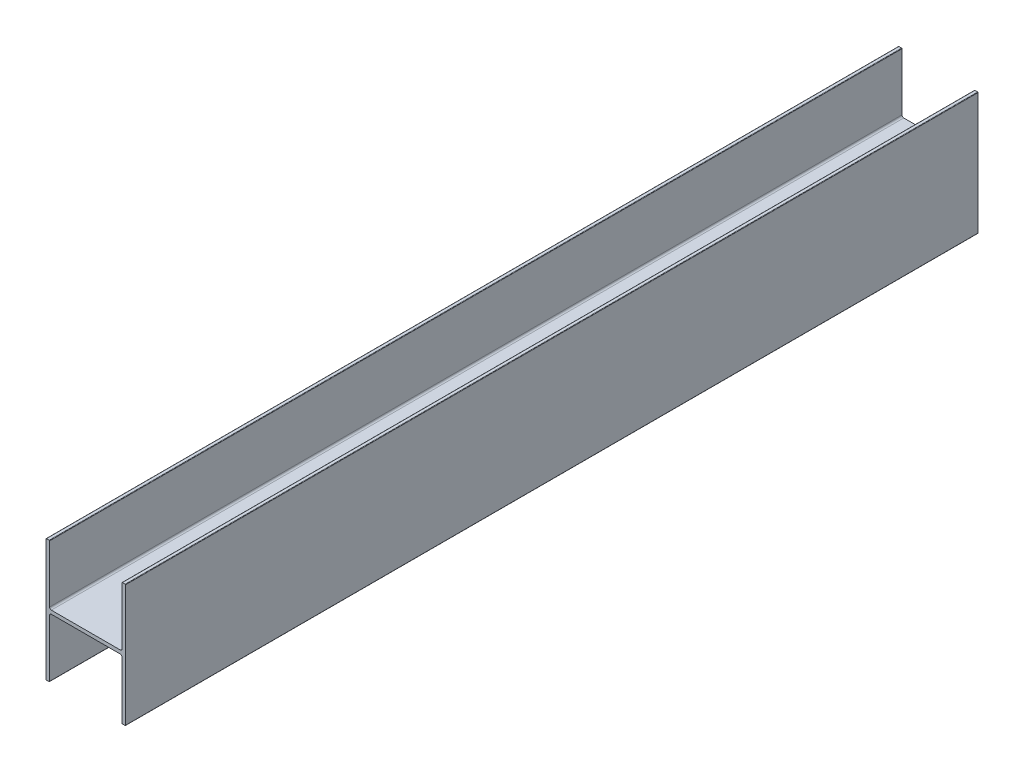
ISO-10303-21;
HEADER;
FILE_DESCRIPTION(('STEP AP214'),'2;1');
FILE_NAME('part.step','',(''),(''),'','','');
FILE_SCHEMA(('AUTOMOTIVE_DESIGN { 1 0 10303 214 1 1 1 1 }'));
ENDSEC;
DATA;
#1=APPLICATION_CONTEXT('core data for automotive mechanical design processes');
#2=APPLICATION_PROTOCOL_DEFINITION('international standard','automotive_design',2000,#1);
#3=PRODUCT_CONTEXT('',#1,'mechanical');
#4=PRODUCT('Part','Part','',(#3));
#5=PRODUCT_RELATED_PRODUCT_CATEGORY('part','',(#4));
#6=PRODUCT_DEFINITION_FORMATION('','',#4);
#7=PRODUCT_DEFINITION_CONTEXT('part definition',#1,'design');
#8=PRODUCT_DEFINITION('design','',#6,#7);
#9=PRODUCT_DEFINITION_SHAPE('','',#8);
#10=(LENGTH_UNIT() NAMED_UNIT(*) SI_UNIT(.MILLI.,.METRE.));
#11=(NAMED_UNIT(*) PLANE_ANGLE_UNIT() SI_UNIT($,.RADIAN.));
#12=(NAMED_UNIT(*) SI_UNIT($,.STERADIAN.) SOLID_ANGLE_UNIT());
#13=UNCERTAINTY_MEASURE_WITH_UNIT(LENGTH_MEASURE(1.E-05),#10,'distance_accuracy_value','');
#14=(GEOMETRIC_REPRESENTATION_CONTEXT(3) GLOBAL_UNCERTAINTY_ASSIGNED_CONTEXT((#13)) GLOBAL_UNIT_ASSIGNED_CONTEXT((#10,
#11,#12)) REPRESENTATION_CONTEXT('',''));
#15=CARTESIAN_POINT('',(0.,0.,0.));
#16=DIRECTION('',(0.,0.,1.));
#17=DIRECTION('',(1.,0.,0.));
#18=AXIS2_PLACEMENT_3D('',#15,#16,#17);
#19=CARTESIAN_POINT('',(12.954,-21.8948,152.4));
#20=DIRECTION('',(0.,1.,0.));
#21=DIRECTION('',(0.,0.,1.));
#22=AXIS2_PLACEMENT_3D('',#19,#20,#21);
#23=PLANE('',#22);
#24=DIRECTION('',(1.,0.,0.));
#25=VECTOR('',#24,1.);
#26=CARTESIAN_POINT('',(12.954,-21.8948,-152.4));
#27=LINE('',#26,#25);
#28=CARTESIAN_POINT('',(13.11275,-21.8948,-152.4));
#29=VERTEX_POINT('',#28);
#30=CARTESIAN_POINT('',(14.06525,-21.8948,-152.4));
#31=VERTEX_POINT('',#30);
#32=EDGE_CURVE('E475',#29,#31,#27,.T.);
#33=ORIENTED_EDGE('',*,*,#32,.T.);
#34=DIRECTION('',(0.,0.,-1.));
#35=VECTOR('',#34,1.);
#36=CARTESIAN_POINT('',(14.06525,-21.8948,152.4));
#37=LINE('',#36,#35);
#38=CARTESIAN_POINT('',(14.06525,-21.8948,152.4));
#39=VERTEX_POINT('',#38);
#40=EDGE_CURVE('E366',#31,#39,#37,.F.);
#41=ORIENTED_EDGE('',*,*,#40,.T.);
#42=DIRECTION('',(1.,0.,0.));
#43=VECTOR('',#42,1.);
#44=CARTESIAN_POINT('',(12.954,-21.8948,152.4));
#45=LINE('',#44,#43);
#46=CARTESIAN_POINT('',(13.11275,-21.8948,152.4));
#47=VERTEX_POINT('',#46);
#48=EDGE_CURVE('E242',#47,#39,#45,.T.);
#49=ORIENTED_EDGE('',*,*,#48,.F.);
#50=DIRECTION('',(0.,0.,-1.));
#51=VECTOR('',#50,1.);
#52=CARTESIAN_POINT('',(13.11275,-21.8948,152.4));
#53=LINE('',#52,#51);
#54=EDGE_CURVE('E362',#47,#29,#53,.T.);
#55=ORIENTED_EDGE('',*,*,#54,.T.);
#56=EDGE_LOOP('',(#33,#41,#49,#55));
#57=FACE_BOUND('',#56,.T.);
#58=ADVANCED_FACE('F41',(#57),#23,.F.);
#59=CARTESIAN_POINT('',(14.224,-21.8948,152.4));
#60=DIRECTION('',(-1.,0.,0.));
#61=DIRECTION('',(0.,-1.,0.));
#62=AXIS2_PLACEMENT_3D('',#59,#60,#61);
#63=PLANE('',#62);
#64=DIRECTION('',(0.,1.,0.));
#65=VECTOR('',#64,1.);
#66=CARTESIAN_POINT('',(14.224,-21.8948,152.4));
#67=LINE('',#66,#65);
#68=CARTESIAN_POINT('',(14.224,-21.73605,152.4));
#69=VERTEX_POINT('',#68);
#70=CARTESIAN_POINT('',(14.224,21.73605,152.4));
#71=VERTEX_POINT('',#70);
#72=EDGE_CURVE('E251',#69,#71,#67,.T.);
#73=ORIENTED_EDGE('',*,*,#72,.F.);
#74=DIRECTION('',(0.,0.,-1.));
#75=VECTOR('',#74,1.);
#76=CARTESIAN_POINT('',(14.224,-21.73605,152.4));
#77=LINE('',#76,#75);
#78=CARTESIAN_POINT('',(14.224,-21.73605,-152.4));
#79=VERTEX_POINT('',#78);
#80=EDGE_CURVE('E334',#69,#79,#77,.T.);
#81=ORIENTED_EDGE('',*,*,#80,.T.);
#82=DIRECTION('',(0.,1.,0.));
#83=VECTOR('',#82,1.);
#84=CARTESIAN_POINT('',(14.224,-21.8948,-152.4));
#85=LINE('',#84,#83);
#86=CARTESIAN_POINT('',(14.224,21.73605,-152.4));
#87=VERTEX_POINT('',#86);
#88=EDGE_CURVE('E491',#79,#87,#85,.T.);
#89=ORIENTED_EDGE('',*,*,#88,.T.);
#90=DIRECTION('',(0.,0.,-1.));
#91=VECTOR('',#90,1.);
#92=CARTESIAN_POINT('',(14.224,21.73605,152.4));
#93=LINE('',#92,#91);
#94=EDGE_CURVE('E331',#87,#71,#93,.F.);
#95=ORIENTED_EDGE('',*,*,#94,.T.);
#96=EDGE_LOOP('',(#73,#81,#89,#95));
#97=FACE_BOUND('',#96,.T.);
#98=ADVANCED_FACE('F490',(#97),#63,.F.);
#99=CARTESIAN_POINT('',(14.224,21.8948,152.4));
#100=DIRECTION('',(0.,-1.,0.));
#101=DIRECTION('',(0.,0.,-1.));
#102=AXIS2_PLACEMENT_3D('',#99,#100,#101);
#103=PLANE('',#102);
#104=DIRECTION('',(-1.,0.,0.));
#105=VECTOR('',#104,1.);
#106=CARTESIAN_POINT('',(14.224,21.8948,152.4));
#107=LINE('',#106,#105);
#108=CARTESIAN_POINT('',(14.06525,21.8948,152.4));
#109=VERTEX_POINT('',#108);
#110=CARTESIAN_POINT('',(13.11275,21.8948,152.4));
#111=VERTEX_POINT('',#110);
#112=EDGE_CURVE('E255',#109,#111,#107,.T.);
#113=ORIENTED_EDGE('',*,*,#112,.F.);
#114=DIRECTION('',(0.,0.,-1.));
#115=VECTOR('',#114,1.);
#116=CARTESIAN_POINT('',(14.06525,21.8948,152.4));
#117=LINE('',#116,#115);
#118=CARTESIAN_POINT('',(14.06525,21.8948,-152.4));
#119=VERTEX_POINT('',#118);
#120=EDGE_CURVE('E415',#109,#119,#117,.T.);
#121=ORIENTED_EDGE('',*,*,#120,.T.);
#122=DIRECTION('',(-1.,0.,0.));
#123=VECTOR('',#122,1.);
#124=CARTESIAN_POINT('',(14.224,21.8948,-152.4));
#125=LINE('',#124,#123);
#126=CARTESIAN_POINT('',(13.11275,21.8948,-152.4));
#127=VERTEX_POINT('',#126);
#128=EDGE_CURVE('E495',#119,#127,#125,.T.);
#129=ORIENTED_EDGE('',*,*,#128,.T.);
#130=DIRECTION('',(0.,0.,-1.));
#131=VECTOR('',#130,1.);
#132=CARTESIAN_POINT('',(13.11275,21.8948,152.4));
#133=LINE('',#132,#131);
#134=EDGE_CURVE('E412',#127,#111,#133,.F.);
#135=ORIENTED_EDGE('',*,*,#134,.T.);
#136=EDGE_LOOP('',(#113,#121,#129,#135));
#137=FACE_BOUND('',#136,.T.);
#138=ADVANCED_FACE('F550',(#137),#103,.F.);
#139=CARTESIAN_POINT('',(12.954,21.8948,152.4));
#140=DIRECTION('',(1.,0.,0.));
#141=DIRECTION('',(0.,1.,0.));
#142=AXIS2_PLACEMENT_3D('',#139,#140,#141);
#143=PLANE('',#142);
#144=DIRECTION('',(0.,-1.,0.));
#145=VECTOR('',#144,1.);
#146=CARTESIAN_POINT('',(12.954,21.8948,152.4));
#147=LINE('',#146,#145);
#148=CARTESIAN_POINT('',(12.954,21.73605,152.4));
#149=VERTEX_POINT('',#148);
#150=CARTESIAN_POINT('',(12.954,1.26999999999999,152.4));
#151=VERTEX_POINT('',#150);
#152=EDGE_CURVE('E259',#149,#151,#147,.T.);
#153=ORIENTED_EDGE('',*,*,#152,.F.);
#154=DIRECTION('',(0.,0.,-1.));
#155=VECTOR('',#154,1.);
#156=CARTESIAN_POINT('',(12.954,21.73605,152.4));
#157=LINE('',#156,#155);
#158=CARTESIAN_POINT('',(12.954,21.73605,-152.4));
#159=VERTEX_POINT('',#158);
#160=EDGE_CURVE('E419',#149,#159,#157,.T.);
#161=ORIENTED_EDGE('',*,*,#160,.T.);
#162=DIRECTION('',(0.,-1.,0.));
#163=VECTOR('',#162,1.);
#164=CARTESIAN_POINT('',(12.954,21.8948,-152.4));
#165=LINE('',#164,#163);
#166=CARTESIAN_POINT('',(12.954,1.26999999999999,-152.4));
#167=VERTEX_POINT('',#166);
#168=EDGE_CURVE('E501',#159,#167,#165,.T.);
#169=ORIENTED_EDGE('',*,*,#168,.T.);
#170=DIRECTION('',(0.,0.,-1.));
#171=VECTOR('',#170,1.);
#172=CARTESIAN_POINT('',(12.954,1.26999999999999,152.4));
#173=LINE('',#172,#171);
#174=EDGE_CURVE('E304',#167,#151,#173,.F.);
#175=ORIENTED_EDGE('',*,*,#174,.T.);
#176=EDGE_LOOP('',(#153,#161,#169,#175));
#177=FACE_BOUND('',#176,.T.);
#178=ADVANCED_FACE('F618',(#177),#143,.F.);
#179=CARTESIAN_POINT('',(12.954,0.634999999999994,152.4));
#180=DIRECTION('',(0.,-1.,0.));
#181=DIRECTION('',(1.,0.,0.));
#182=AXIS2_PLACEMENT_3D('',#179,#180,#181);
#183=PLANE('',#182);
#184=DIRECTION('',(-1.,0.,0.));
#185=VECTOR('',#184,1.);
#186=CARTESIAN_POINT('',(12.954,0.634999999999994,152.4));
#187=LINE('',#186,#185);
#188=CARTESIAN_POINT('',(12.319,0.634999999999994,152.4));
#189=VERTEX_POINT('',#188);
#190=CARTESIAN_POINT('',(-12.319,0.635,152.4));
#191=VERTEX_POINT('',#190);
#192=EDGE_CURVE('E262',#189,#191,#187,.T.);
#193=ORIENTED_EDGE('',*,*,#192,.F.);
#194=DIRECTION('',(0.,0.,-1.));
#195=VECTOR('',#194,1.);
#196=CARTESIAN_POINT('',(12.319,0.634999999999994,-152.4));
#197=LINE('',#196,#195);
#198=CARTESIAN_POINT('',(12.319,0.634999999999994,-152.4));
#199=VERTEX_POINT('',#198);
#200=EDGE_CURVE('E300',#189,#199,#197,.T.);
#201=ORIENTED_EDGE('',*,*,#200,.T.);
#202=DIRECTION('',(-1.,0.,0.));
#203=VECTOR('',#202,1.);
#204=CARTESIAN_POINT('',(12.954,0.634999999999994,-152.4));
#205=LINE('',#204,#203);
#206=CARTESIAN_POINT('',(-12.319,0.635,-152.4));
#207=VERTEX_POINT('',#206);
#208=EDGE_CURVE('E450',#199,#207,#205,.T.);
#209=ORIENTED_EDGE('',*,*,#208,.T.);
#210=DIRECTION('',(0.,0.,-1.));
#211=VECTOR('',#210,1.);
#212=CARTESIAN_POINT('',(-12.319,0.635,152.4));
#213=LINE('',#212,#211);
#214=EDGE_CURVE('E297',#207,#191,#213,.F.);
#215=ORIENTED_EDGE('',*,*,#214,.T.);
#216=EDGE_LOOP('',(#193,#201,#209,#215));
#217=FACE_BOUND('',#216,.T.);
#218=ADVANCED_FACE('F513',(#217),#183,.F.);
#219=CARTESIAN_POINT('',(-12.954,0.635,152.4));
#220=DIRECTION('',(-1.,0.,0.));
#221=DIRECTION('',(0.,-1.,0.));
#222=AXIS2_PLACEMENT_3D('',#219,#220,#221);
#223=PLANE('',#222);
#224=DIRECTION('',(0.,1.,0.));
#225=VECTOR('',#224,1.);
#226=CARTESIAN_POINT('',(-12.954,0.635,-152.4));
#227=LINE('',#226,#225);
#228=CARTESIAN_POINT('',(-12.954,1.27,-152.4));
#229=VERTEX_POINT('',#228);
#230=CARTESIAN_POINT('',(-12.954,21.73605,-152.4));
#231=VERTEX_POINT('',#230);
#232=EDGE_CURVE('E443',#229,#231,#227,.T.);
#233=ORIENTED_EDGE('',*,*,#232,.T.);
#234=DIRECTION('',(0.,0.,-1.));
#235=VECTOR('',#234,1.);
#236=CARTESIAN_POINT('',(-12.954,21.73605,152.4));
#237=LINE('',#236,#235);
#238=CARTESIAN_POINT('',(-12.954,21.73605,152.4));
#239=VERTEX_POINT('',#238);
#240=EDGE_CURVE('E11',#231,#239,#237,.F.);
#241=ORIENTED_EDGE('',*,*,#240,.T.);
#242=DIRECTION('',(0.,1.,0.));
#243=VECTOR('',#242,1.);
#244=CARTESIAN_POINT('',(-12.954,0.635,152.4));
#245=LINE('',#244,#243);
#246=CARTESIAN_POINT('',(-12.954,1.27,152.4));
#247=VERTEX_POINT('',#246);
#248=EDGE_CURVE('E266',#247,#239,#245,.T.);
#249=ORIENTED_EDGE('',*,*,#248,.F.);
#250=DIRECTION('',(0.,0.,-1.));
#251=VECTOR('',#250,1.);
#252=CARTESIAN_POINT('',(-12.954,1.27,-152.4));
#253=LINE('',#252,#251);
#254=EDGE_CURVE('E218',#247,#229,#253,.T.);
#255=ORIENTED_EDGE('',*,*,#254,.T.);
#256=EDGE_LOOP('',(#233,#241,#249,#255));
#257=FACE_BOUND('',#256,.T.);
#258=ADVANCED_FACE('F521',(#257),#223,.F.);
#259=CARTESIAN_POINT('',(-12.954,21.8948,152.4));
#260=DIRECTION('',(0.,-1.,0.));
#261=DIRECTION('',(0.,0.,-1.));
#262=AXIS2_PLACEMENT_3D('',#259,#260,#261);
#263=PLANE('',#262);
#264=DIRECTION('',(-1.,0.,0.));
#265=VECTOR('',#264,1.);
#266=CARTESIAN_POINT('',(-12.954,21.8948,152.4));
#267=LINE('',#266,#265);
#268=CARTESIAN_POINT('',(-13.11275,21.8948,152.4));
#269=VERTEX_POINT('',#268);
#270=CARTESIAN_POINT('',(-14.06525,21.8948,152.4));
#271=VERTEX_POINT('',#270);
#272=EDGE_CURVE('E270',#269,#271,#267,.T.);
#273=ORIENTED_EDGE('',*,*,#272,.F.);
#274=DIRECTION('',(0.,0.,-1.));
#275=VECTOR('',#274,1.);
#276=CARTESIAN_POINT('',(-13.11275,21.8948,152.4));
#277=LINE('',#276,#275);
#278=CARTESIAN_POINT('',(-13.11275,21.8948,-152.4));
#279=VERTEX_POINT('',#278);
#280=EDGE_CURVE('E50',#269,#279,#277,.T.);
#281=ORIENTED_EDGE('',*,*,#280,.T.);
#282=DIRECTION('',(-1.,0.,0.));
#283=VECTOR('',#282,1.);
#284=CARTESIAN_POINT('',(-12.954,21.8948,-152.4));
#285=LINE('',#284,#283);
#286=CARTESIAN_POINT('',(-14.06525,21.8948,-152.4));
#287=VERTEX_POINT('',#286);
#288=EDGE_CURVE('E434',#279,#287,#285,.T.);
#289=ORIENTED_EDGE('',*,*,#288,.T.);
#290=DIRECTION('',(0.,0.,-1.));
#291=VECTOR('',#290,1.);
#292=CARTESIAN_POINT('',(-14.06525,21.8948,152.4));
#293=LINE('',#292,#291);
#294=EDGE_CURVE('E423',#287,#271,#293,.F.);
#295=ORIENTED_EDGE('',*,*,#294,.T.);
#296=EDGE_LOOP('',(#273,#281,#289,#295));
#297=FACE_BOUND('',#296,.T.);
#298=ADVANCED_FACE('F433',(#297),#263,.F.);
#299=CARTESIAN_POINT('',(-14.224,21.8948,152.4));
#300=DIRECTION('',(1.,0.,0.));
#301=DIRECTION('',(0.,1.,0.));
#302=AXIS2_PLACEMENT_3D('',#299,#300,#301);
#303=PLANE('',#302);
#304=DIRECTION('',(0.,-1.,0.));
#305=VECTOR('',#304,1.);
#306=CARTESIAN_POINT('',(-14.224,21.8948,-152.4));
#307=LINE('',#306,#305);
#308=CARTESIAN_POINT('',(-14.224,21.73605,-152.4));
#309=VERTEX_POINT('',#308);
#310=CARTESIAN_POINT('',(-14.224,-21.73605,-152.4));
#311=VERTEX_POINT('',#310);
#312=EDGE_CURVE('E442',#309,#311,#307,.T.);
#313=ORIENTED_EDGE('',*,*,#312,.T.);
#314=DIRECTION('',(0.,0.,-1.));
#315=VECTOR('',#314,1.);
#316=CARTESIAN_POINT('',(-14.224,-21.73605,152.4));
#317=LINE('',#316,#315);
#318=CARTESIAN_POINT('',(-14.224,-21.73605,152.4));
#319=VERTEX_POINT('',#318);
#320=EDGE_CURVE('E409',#311,#319,#317,.F.);
#321=ORIENTED_EDGE('',*,*,#320,.T.);
#322=DIRECTION('',(0.,-1.,0.));
#323=VECTOR('',#322,1.);
#324=CARTESIAN_POINT('',(-14.224,21.8948,152.4));
#325=LINE('',#324,#323);
#326=CARTESIAN_POINT('',(-14.224,21.73605,152.4));
#327=VERTEX_POINT('',#326);
#328=EDGE_CURVE('E274',#327,#319,#325,.T.);
#329=ORIENTED_EDGE('',*,*,#328,.F.);
#330=DIRECTION('',(0.,0.,-1.));
#331=VECTOR('',#330,1.);
#332=CARTESIAN_POINT('',(-14.224,21.73605,152.4));
#333=LINE('',#332,#331);
#334=EDGE_CURVE('E405',#327,#309,#333,.T.);
#335=ORIENTED_EDGE('',*,*,#334,.T.);
#336=EDGE_LOOP('',(#313,#321,#329,#335));
#337=FACE_BOUND('',#336,.T.);
#338=ADVANCED_FACE('F529',(#337),#303,.F.);
#339=CARTESIAN_POINT('',(-14.224,-21.8948,152.4));
#340=DIRECTION('',(0.,1.,0.));
#341=DIRECTION('',(0.,0.,1.));
#342=AXIS2_PLACEMENT_3D('',#339,#340,#341);
#343=PLANE('',#342);
#344=DIRECTION('',(1.,0.,0.));
#345=VECTOR('',#344,1.);
#346=CARTESIAN_POINT('',(-14.224,-21.8948,-152.4));
#347=LINE('',#346,#345);
#348=CARTESIAN_POINT('',(-14.06525,-21.8948,-152.4));
#349=VERTEX_POINT('',#348);
#350=CARTESIAN_POINT('',(-13.11275,-21.8948,-152.4));
#351=VERTEX_POINT('',#350);
#352=EDGE_CURVE('E244',#349,#351,#347,.T.);
#353=ORIENTED_EDGE('',*,*,#352,.T.);
#354=DIRECTION('',(0.,0.,-1.));
#355=VECTOR('',#354,1.);
#356=CARTESIAN_POINT('',(-13.11275,-21.8948,152.4));
#357=LINE('',#356,#355);
#358=CARTESIAN_POINT('',(-13.11275,-21.8948,152.4));
#359=VERTEX_POINT('',#358);
#360=EDGE_CURVE('E402',#351,#359,#357,.F.);
#361=ORIENTED_EDGE('',*,*,#360,.T.);
#362=DIRECTION('',(1.,0.,0.));
#363=VECTOR('',#362,1.);
#364=CARTESIAN_POINT('',(-14.224,-21.8948,152.4));
#365=LINE('',#364,#363);
#366=CARTESIAN_POINT('',(-14.06525,-21.8948,152.4));
#367=VERTEX_POINT('',#366);
#368=EDGE_CURVE('E278',#367,#359,#365,.T.);
#369=ORIENTED_EDGE('',*,*,#368,.F.);
#370=DIRECTION('',(0.,0.,-1.));
#371=VECTOR('',#370,1.);
#372=CARTESIAN_POINT('',(-14.06525,-21.8948,152.4));
#373=LINE('',#372,#371);
#374=EDGE_CURVE('E398',#367,#349,#373,.T.);
#375=ORIENTED_EDGE('',*,*,#374,.T.);
#376=EDGE_LOOP('',(#353,#361,#369,#375));
#377=FACE_BOUND('',#376,.T.);
#378=ADVANCED_FACE('F459',(#377),#343,.F.);
#379=CARTESIAN_POINT('',(-12.954,-21.8948,152.4));
#380=DIRECTION('',(-1.,0.,0.));
#381=DIRECTION('',(0.,-1.,0.));
#382=AXIS2_PLACEMENT_3D('',#379,#380,#381);
#383=PLANE('',#382);
#384=DIRECTION('',(0.,1.,0.));
#385=VECTOR('',#384,1.);
#386=CARTESIAN_POINT('',(-12.954,-21.8948,152.4));
#387=LINE('',#386,#385);
#388=CARTESIAN_POINT('',(-12.954,-21.73605,152.4));
#389=VERTEX_POINT('',#388);
#390=CARTESIAN_POINT('',(-12.954,-1.27,152.4));
#391=VERTEX_POINT('',#390);
#392=EDGE_CURVE('E281',#389,#391,#387,.T.);
#393=ORIENTED_EDGE('',*,*,#392,.F.);
#394=DIRECTION('',(0.,0.,-1.));
#395=VECTOR('',#394,1.);
#396=CARTESIAN_POINT('',(-12.954,-21.73605,152.4));
#397=LINE('',#396,#395);
#398=CARTESIAN_POINT('',(-12.954,-21.73605,-152.4));
#399=VERTEX_POINT('',#398);
#400=EDGE_CURVE('E394',#389,#399,#397,.T.);
#401=ORIENTED_EDGE('',*,*,#400,.T.);
#402=DIRECTION('',(0.,1.,0.));
#403=VECTOR('',#402,1.);
#404=CARTESIAN_POINT('',(-12.954,-21.8948,-152.4));
#405=LINE('',#404,#403);
#406=CARTESIAN_POINT('',(-12.954,-1.27,-152.4));
#407=VERTEX_POINT('',#406);
#408=EDGE_CURVE('E237',#399,#407,#405,.T.);
#409=ORIENTED_EDGE('',*,*,#408,.T.);
#410=DIRECTION('',(0.,0.,-1.));
#411=VECTOR('',#410,1.);
#412=CARTESIAN_POINT('',(-12.954,-1.27,152.4));
#413=LINE('',#412,#411);
#414=EDGE_CURVE('E212',#407,#391,#413,.F.);
#415=ORIENTED_EDGE('',*,*,#414,.T.);
#416=EDGE_LOOP('',(#393,#401,#409,#415));
#417=FACE_BOUND('',#416,.T.);
#418=ADVANCED_FACE('F466',(#417),#383,.F.);
#419=CARTESIAN_POINT('',(-12.954,-0.635,152.4));
#420=DIRECTION('',(0.,1.,0.));
#421=DIRECTION('',(-1.,0.,0.));
#422=AXIS2_PLACEMENT_3D('',#419,#420,#421);
#423=PLANE('',#422);
#424=DIRECTION('',(1.,0.,0.));
#425=VECTOR('',#424,1.);
#426=CARTESIAN_POINT('',(-12.954,-0.635,152.4));
#427=LINE('',#426,#425);
#428=CARTESIAN_POINT('',(-12.319,-0.635,152.4));
#429=VERTEX_POINT('',#428);
#430=CARTESIAN_POINT('',(12.319,-0.634999999999994,152.4));
#431=VERTEX_POINT('',#430);
#432=EDGE_CURVE('E227',#429,#431,#427,.T.);
#433=ORIENTED_EDGE('',*,*,#432,.F.);
#434=DIRECTION('',(0.,0.,-1.));
#435=VECTOR('',#434,1.);
#436=CARTESIAN_POINT('',(-12.319,-0.635,-152.4));
#437=LINE('',#436,#435);
#438=CARTESIAN_POINT('',(-12.319,-0.635,-152.4));
#439=VERTEX_POINT('',#438);
#440=EDGE_CURVE('E210',#429,#439,#437,.T.);
#441=ORIENTED_EDGE('',*,*,#440,.T.);
#442=DIRECTION('',(1.,0.,0.));
#443=VECTOR('',#442,1.);
#444=CARTESIAN_POINT('',(-12.954,-0.635,-152.4));
#445=LINE('',#444,#443);
#446=CARTESIAN_POINT('',(12.319,-0.634999999999994,-152.4));
#447=VERTEX_POINT('',#446);
#448=EDGE_CURVE('E224',#439,#447,#445,.T.);
#449=ORIENTED_EDGE('',*,*,#448,.T.);
#450=DIRECTION('',(0.,0.,-1.));
#451=VECTOR('',#450,1.);
#452=CARTESIAN_POINT('',(12.319,-0.634999999999994,152.4));
#453=LINE('',#452,#451);
#454=EDGE_CURVE('E229',#447,#431,#453,.F.);
#455=ORIENTED_EDGE('',*,*,#454,.T.);
#456=EDGE_LOOP('',(#433,#441,#449,#455));
#457=FACE_BOUND('',#456,.T.);
#458=ADVANCED_FACE('F223',(#457),#423,.F.);
#459=CARTESIAN_POINT('',(12.954,-0.634999999999994,152.4));
#460=DIRECTION('',(1.,0.,0.));
#461=DIRECTION('',(0.,1.,0.));
#462=AXIS2_PLACEMENT_3D('',#459,#460,#461);
#463=PLANE('',#462);
#464=DIRECTION('',(0.,-1.,0.));
#465=VECTOR('',#464,1.);
#466=CARTESIAN_POINT('',(12.954,-0.634999999999994,-152.4));
#467=LINE('',#466,#465);
#468=CARTESIAN_POINT('',(12.954,-1.26999999999999,-152.4));
#469=VERTEX_POINT('',#468);
#470=CARTESIAN_POINT('',(12.954,-21.73605,-152.4));
#471=VERTEX_POINT('',#470);
#472=EDGE_CURVE('E236',#469,#471,#467,.T.);
#473=ORIENTED_EDGE('',*,*,#472,.T.);
#474=DIRECTION('',(0.,0.,-1.));
#475=VECTOR('',#474,1.);
#476=CARTESIAN_POINT('',(12.954,-21.73605,152.4));
#477=LINE('',#476,#475);
#478=CARTESIAN_POINT('',(12.954,-21.73605,152.4));
#479=VERTEX_POINT('',#478);
#480=EDGE_CURVE('E57',#471,#479,#477,.F.);
#481=ORIENTED_EDGE('',*,*,#480,.T.);
#482=DIRECTION('',(0.,-1.,0.));
#483=VECTOR('',#482,1.);
#484=CARTESIAN_POINT('',(12.954,-0.634999999999994,152.4));
#485=LINE('',#484,#483);
#486=CARTESIAN_POINT('',(12.954,-1.26999999999999,152.4));
#487=VERTEX_POINT('',#486);
#488=EDGE_CURVE('E286',#487,#479,#485,.T.);
#489=ORIENTED_EDGE('',*,*,#488,.F.);
#490=DIRECTION('',(0.,0.,-1.));
#491=VECTOR('',#490,1.);
#492=CARTESIAN_POINT('',(12.954,-1.26999999999999,-152.4));
#493=LINE('',#492,#491);
#494=EDGE_CURVE('E293',#487,#469,#493,.T.);
#495=ORIENTED_EDGE('',*,*,#494,.T.);
#496=EDGE_LOOP('',(#473,#481,#489,#495));
#497=FACE_BOUND('',#496,.T.);
#498=ADVANCED_FACE('F472',(#497),#463,.F.);
#499=CARTESIAN_POINT('',(14.224,-21.8948,152.4));
#500=DIRECTION('',(0.,0.,1.));
#501=DIRECTION('',(1.,0.,0.));
#502=AXIS2_PLACEMENT_3D('',#499,#500,#501);
#503=PLANE('',#502);
#504=ORIENTED_EDGE('',*,*,#48,.T.);
#505=CARTESIAN_POINT('',(14.06525,-21.73605,152.4));
#506=DIRECTION('',(0.,0.,1.));
#507=DIRECTION('',(1.,0.,0.));
#508=AXIS2_PLACEMENT_3D('',#505,#506,#507);
#509=CIRCLE('',#508,0.15875);
#510=EDGE_CURVE('E389',#39,#69,#509,.T.);
#511=ORIENTED_EDGE('',*,*,#510,.T.);
#512=ORIENTED_EDGE('',*,*,#72,.T.);
#513=CARTESIAN_POINT('',(14.06525,21.73605,152.4));
#514=DIRECTION('',(0.,0.,1.));
#515=DIRECTION('',(1.,0.,0.));
#516=AXIS2_PLACEMENT_3D('',#513,#514,#515);
#517=CIRCLE('',#516,0.15875);
#518=EDGE_CURVE('E378',#71,#109,#517,.T.);
#519=ORIENTED_EDGE('',*,*,#518,.T.);
#520=ORIENTED_EDGE('',*,*,#112,.T.);
#521=CARTESIAN_POINT('',(13.11275,21.73605,152.4));
#522=DIRECTION('',(0.,0.,1.));
#523=DIRECTION('',(1.,0.,0.));
#524=AXIS2_PLACEMENT_3D('',#521,#522,#523);
#525=CIRCLE('',#524,0.15875);
#526=EDGE_CURVE('E375',#111,#149,#525,.T.);
#527=ORIENTED_EDGE('',*,*,#526,.T.);
#528=ORIENTED_EDGE('',*,*,#152,.T.);
#529=CARTESIAN_POINT('',(12.319,1.26999999999999,152.4));
#530=DIRECTION('',(0.,0.,1.));
#531=DIRECTION('',(1.,0.,0.));
#532=AXIS2_PLACEMENT_3D('',#529,#530,#531);
#533=CIRCLE('',#532,0.635);
#534=EDGE_CURVE('E322',#151,#189,#533,.F.);
#535=ORIENTED_EDGE('',*,*,#534,.T.);
#536=ORIENTED_EDGE('',*,*,#192,.T.);
#537=CARTESIAN_POINT('',(-12.319,1.27,152.4));
#538=DIRECTION('',(0.,0.,1.));
#539=DIRECTION('',(1.,0.,0.));
#540=AXIS2_PLACEMENT_3D('',#537,#538,#539);
#541=CIRCLE('',#540,0.635);
#542=EDGE_CURVE('E328',#191,#247,#541,.F.);
#543=ORIENTED_EDGE('',*,*,#542,.T.);
#544=ORIENTED_EDGE('',*,*,#248,.T.);
#545=CARTESIAN_POINT('',(-13.11275,21.73605,152.4));
#546=DIRECTION('',(0.,0.,1.));
#547=DIRECTION('',(1.,0.,0.));
#548=AXIS2_PLACEMENT_3D('',#545,#546,#547);
#549=CIRCLE('',#548,0.15875);
#550=EDGE_CURVE('E372',#239,#269,#549,.T.);
#551=ORIENTED_EDGE('',*,*,#550,.T.);
#552=ORIENTED_EDGE('',*,*,#272,.T.);
#553=CARTESIAN_POINT('',(-14.06525,21.73605,152.4));
#554=DIRECTION('',(0.,0.,1.));
#555=DIRECTION('',(1.,0.,0.));
#556=AXIS2_PLACEMENT_3D('',#553,#554,#555);
#557=CIRCLE('',#556,0.15875);
#558=EDGE_CURVE('E369',#271,#327,#557,.T.);
#559=ORIENTED_EDGE('',*,*,#558,.T.);
#560=ORIENTED_EDGE('',*,*,#328,.T.);
#561=CARTESIAN_POINT('',(-14.06525,-21.73605,152.4));
#562=DIRECTION('',(0.,0.,1.));
#563=DIRECTION('',(1.,0.,0.));
#564=AXIS2_PLACEMENT_3D('',#561,#562,#563);
#565=CIRCLE('',#564,0.15875);
#566=EDGE_CURVE('E381',#319,#367,#565,.T.);
#567=ORIENTED_EDGE('',*,*,#566,.T.);
#568=ORIENTED_EDGE('',*,*,#368,.T.);
#569=CARTESIAN_POINT('',(-13.11275,-21.73605,152.4));
#570=DIRECTION('',(0.,0.,1.));
#571=DIRECTION('',(1.,0.,0.));
#572=AXIS2_PLACEMENT_3D('',#569,#570,#571);
#573=CIRCLE('',#572,0.15875);
#574=EDGE_CURVE('E65',#359,#389,#573,.T.);
#575=ORIENTED_EDGE('',*,*,#574,.T.);
#576=ORIENTED_EDGE('',*,*,#392,.T.);
#577=CARTESIAN_POINT('',(-12.319,-1.27,152.4));
#578=DIRECTION('',(0.,0.,1.));
#579=DIRECTION('',(1.,0.,0.));
#580=AXIS2_PLACEMENT_3D('',#577,#578,#579);
#581=CIRCLE('',#580,0.635);
#582=EDGE_CURVE('E217',#391,#429,#581,.F.);
#583=ORIENTED_EDGE('',*,*,#582,.T.);
#584=ORIENTED_EDGE('',*,*,#432,.T.);
#585=CARTESIAN_POINT('',(12.319,-1.26999999999999,152.4));
#586=DIRECTION('',(0.,0.,1.));
#587=DIRECTION('',(1.,0.,0.));
#588=AXIS2_PLACEMENT_3D('',#585,#586,#587);
#589=CIRCLE('',#588,0.635);
#590=EDGE_CURVE('E315',#431,#487,#589,.F.);
#591=ORIENTED_EDGE('',*,*,#590,.T.);
#592=ORIENTED_EDGE('',*,*,#488,.T.);
#593=CARTESIAN_POINT('',(13.11275,-21.73605,152.4));
#594=DIRECTION('',(0.,0.,1.));
#595=DIRECTION('',(1.,0.,0.));
#596=AXIS2_PLACEMENT_3D('',#593,#594,#595);
#597=CIRCLE('',#596,0.15875);
#598=EDGE_CURVE('E386',#479,#47,#597,.T.);
#599=ORIENTED_EDGE('',*,*,#598,.T.);
#600=EDGE_LOOP('',(#504,#511,#512,#519,#520,#527,#528,#535,#536,#543,#544,#551,#552,#559,#560,
#567,#568,#575,#576,#583,#584,#591,#592,#599));
#601=FACE_BOUND('',#600,.T.);
#602=ADVANCED_FACE('F467',(#601),#503,.T.);
#603=CARTESIAN_POINT('',(14.224,-21.8948,-152.4));
#604=DIRECTION('',(0.,0.,1.));
#605=DIRECTION('',(1.,0.,0.));
#606=AXIS2_PLACEMENT_3D('',#603,#604,#605);
#607=PLANE('',#606);
#608=ORIENTED_EDGE('',*,*,#88,.F.);
#609=CARTESIAN_POINT('',(14.06525,-21.73605,-152.4));
#610=DIRECTION('',(0.,0.,1.));
#611=DIRECTION('',(1.,0.,0.));
#612=AXIS2_PLACEMENT_3D('',#609,#610,#611);
#613=CIRCLE('',#612,0.15875);
#614=EDGE_CURVE('E359',#79,#31,#613,.F.);
#615=ORIENTED_EDGE('',*,*,#614,.T.);
#616=ORIENTED_EDGE('',*,*,#32,.F.);
#617=CARTESIAN_POINT('',(13.11275,-21.73605,-152.4));
#618=DIRECTION('',(0.,0.,1.));
#619=DIRECTION('',(1.,0.,0.));
#620=AXIS2_PLACEMENT_3D('',#617,#618,#619);
#621=CIRCLE('',#620,0.15875);
#622=EDGE_CURVE('E356',#29,#471,#621,.F.);
#623=ORIENTED_EDGE('',*,*,#622,.T.);
#624=ORIENTED_EDGE('',*,*,#472,.F.);
#625=CARTESIAN_POINT('',(12.319,-1.26999999999999,-152.4));
#626=DIRECTION('',(0.,0.,1.));
#627=DIRECTION('',(1.,0.,0.));
#628=AXIS2_PLACEMENT_3D('',#625,#626,#627);
#629=CIRCLE('',#628,0.635);
#630=EDGE_CURVE('E234',#469,#447,#629,.T.);
#631=ORIENTED_EDGE('',*,*,#630,.T.);
#632=ORIENTED_EDGE('',*,*,#448,.F.);
#633=CARTESIAN_POINT('',(-12.319,-1.27,-152.4));
#634=DIRECTION('',(0.,0.,1.));
#635=DIRECTION('',(1.,0.,0.));
#636=AXIS2_PLACEMENT_3D('',#633,#634,#635);
#637=CIRCLE('',#636,0.635);
#638=EDGE_CURVE('E206',#439,#407,#637,.T.);
#639=ORIENTED_EDGE('',*,*,#638,.T.);
#640=ORIENTED_EDGE('',*,*,#408,.F.);
#641=CARTESIAN_POINT('',(-13.11275,-21.73605,-152.4));
#642=DIRECTION('',(0.,0.,1.));
#643=DIRECTION('',(1.,0.,0.));
#644=AXIS2_PLACEMENT_3D('',#641,#642,#643);
#645=CIRCLE('',#644,0.15875);
#646=EDGE_CURVE('E353',#399,#351,#645,.F.);
#647=ORIENTED_EDGE('',*,*,#646,.T.);
#648=ORIENTED_EDGE('',*,*,#352,.F.);
#649=CARTESIAN_POINT('',(-14.06525,-21.73605,-152.4));
#650=DIRECTION('',(0.,0.,1.));
#651=DIRECTION('',(1.,0.,0.));
#652=AXIS2_PLACEMENT_3D('',#649,#650,#651);
#653=CIRCLE('',#652,0.15875);
#654=EDGE_CURVE('E350',#349,#311,#653,.F.);
#655=ORIENTED_EDGE('',*,*,#654,.T.);
#656=ORIENTED_EDGE('',*,*,#312,.F.);
#657=CARTESIAN_POINT('',(-14.06525,21.73605,-152.4));
#658=DIRECTION('',(0.,0.,1.));
#659=DIRECTION('',(1.,0.,0.));
#660=AXIS2_PLACEMENT_3D('',#657,#658,#659);
#661=CIRCLE('',#660,0.15875);
#662=EDGE_CURVE('E338',#309,#287,#661,.F.);
#663=ORIENTED_EDGE('',*,*,#662,.T.);
#664=ORIENTED_EDGE('',*,*,#288,.F.);
#665=CARTESIAN_POINT('',(-13.11275,21.73605,-152.4));
#666=DIRECTION('',(0.,0.,1.));
#667=DIRECTION('',(1.,0.,0.));
#668=AXIS2_PLACEMENT_3D('',#665,#666,#667);
#669=CIRCLE('',#668,0.15875);
#670=EDGE_CURVE('E341',#279,#231,#669,.F.);
#671=ORIENTED_EDGE('',*,*,#670,.T.);
#672=ORIENTED_EDGE('',*,*,#232,.F.);
#673=CARTESIAN_POINT('',(-12.319,1.27,-152.4));
#674=DIRECTION('',(0.,0.,1.));
#675=DIRECTION('',(1.,0.,0.));
#676=AXIS2_PLACEMENT_3D('',#673,#674,#675);
#677=CIRCLE('',#676,0.635);
#678=EDGE_CURVE('E325',#229,#207,#677,.T.);
#679=ORIENTED_EDGE('',*,*,#678,.T.);
#680=ORIENTED_EDGE('',*,*,#208,.F.);
#681=CARTESIAN_POINT('',(12.319,1.26999999999999,-152.4));
#682=DIRECTION('',(0.,0.,1.));
#683=DIRECTION('',(1.,0.,0.));
#684=AXIS2_PLACEMENT_3D('',#681,#682,#683);
#685=CIRCLE('',#684,0.635);
#686=EDGE_CURVE('E318',#199,#167,#685,.T.);
#687=ORIENTED_EDGE('',*,*,#686,.T.);
#688=ORIENTED_EDGE('',*,*,#168,.F.);
#689=CARTESIAN_POINT('',(13.11275,21.73605,-152.4));
#690=DIRECTION('',(0.,0.,1.));
#691=DIRECTION('',(1.,0.,0.));
#692=AXIS2_PLACEMENT_3D('',#689,#690,#691);
#693=CIRCLE('',#692,0.15875);
#694=EDGE_CURVE('E344',#159,#127,#693,.F.);
#695=ORIENTED_EDGE('',*,*,#694,.T.);
#696=ORIENTED_EDGE('',*,*,#128,.F.);
#697=CARTESIAN_POINT('',(14.06525,21.73605,-152.4));
#698=DIRECTION('',(0.,0.,1.));
#699=DIRECTION('',(1.,0.,0.));
#700=AXIS2_PLACEMENT_3D('',#697,#698,#699);
#701=CIRCLE('',#700,0.15875);
#702=EDGE_CURVE('E347',#119,#87,#701,.F.);
#703=ORIENTED_EDGE('',*,*,#702,.T.);
#704=EDGE_LOOP('',(#608,#615,#616,#623,#624,#631,#632,#639,#640,#647,#648,#655,#656,#663,#664,
#671,#672,#679,#680,#687,#688,#695,#696,#703));
#705=FACE_BOUND('',#704,.T.);
#706=ADVANCED_FACE('F232',(#705),#607,.F.);
#707=CARTESIAN_POINT('',(-12.319,-1.27,152.4));
#708=DIRECTION('',(0.,0.,1.));
#709=DIRECTION('',(1.,0.,0.));
#710=AXIS2_PLACEMENT_3D('',#707,#708,#709);
#711=CYLINDRICAL_SURFACE('',#710,0.635);
#712=ORIENTED_EDGE('',*,*,#582,.F.);
#713=ORIENTED_EDGE('',*,*,#414,.F.);
#714=ORIENTED_EDGE('',*,*,#638,.F.);
#715=ORIENTED_EDGE('',*,*,#440,.F.);
#716=EDGE_LOOP('',(#712,#713,#714,#715));
#717=FACE_BOUND('',#716,.T.);
#718=ADVANCED_FACE('F209',(#717),#711,.F.);
#719=CARTESIAN_POINT('',(12.319,-1.26999999999999,152.4));
#720=DIRECTION('',(0.,0.,1.));
#721=DIRECTION('',(1.,0.,0.));
#722=AXIS2_PLACEMENT_3D('',#719,#720,#721);
#723=CYLINDRICAL_SURFACE('',#722,0.635);
#724=ORIENTED_EDGE('',*,*,#590,.F.);
#725=ORIENTED_EDGE('',*,*,#454,.F.);
#726=ORIENTED_EDGE('',*,*,#630,.F.);
#727=ORIENTED_EDGE('',*,*,#494,.F.);
#728=EDGE_LOOP('',(#724,#725,#726,#727));
#729=FACE_BOUND('',#728,.T.);
#730=ADVANCED_FACE('F471',(#729),#723,.F.);
#731=CARTESIAN_POINT('',(12.319,1.26999999999999,152.4));
#732=DIRECTION('',(0.,0.,1.));
#733=DIRECTION('',(1.,0.,0.));
#734=AXIS2_PLACEMENT_3D('',#731,#732,#733);
#735=CYLINDRICAL_SURFACE('',#734,0.635);
#736=ORIENTED_EDGE('',*,*,#534,.F.);
#737=ORIENTED_EDGE('',*,*,#174,.F.);
#738=ORIENTED_EDGE('',*,*,#686,.F.);
#739=ORIENTED_EDGE('',*,*,#200,.F.);
#740=EDGE_LOOP('',(#736,#737,#738,#739));
#741=FACE_BOUND('',#740,.T.);
#742=ADVANCED_FACE('F558',(#741),#735,.F.);
#743=CARTESIAN_POINT('',(-12.319,1.27,152.4));
#744=DIRECTION('',(0.,0.,1.));
#745=DIRECTION('',(1.,0.,0.));
#746=AXIS2_PLACEMENT_3D('',#743,#744,#745);
#747=CYLINDRICAL_SURFACE('',#746,0.635);
#748=ORIENTED_EDGE('',*,*,#542,.F.);
#749=ORIENTED_EDGE('',*,*,#214,.F.);
#750=ORIENTED_EDGE('',*,*,#678,.F.);
#751=ORIENTED_EDGE('',*,*,#254,.F.);
#752=EDGE_LOOP('',(#748,#749,#750,#751));
#753=FACE_BOUND('',#752,.T.);
#754=ADVANCED_FACE('F517',(#753),#747,.F.);
#755=CARTESIAN_POINT('',(14.06525,-21.73605,152.4));
#756=DIRECTION('',(0.,0.,-1.));
#757=DIRECTION('',(-1.,0.,0.));
#758=AXIS2_PLACEMENT_3D('',#755,#756,#757);
#759=CYLINDRICAL_SURFACE('',#758,0.15875);
#760=ORIENTED_EDGE('',*,*,#510,.F.);
#761=ORIENTED_EDGE('',*,*,#40,.F.);
#762=ORIENTED_EDGE('',*,*,#614,.F.);
#763=ORIENTED_EDGE('',*,*,#80,.F.);
#764=EDGE_LOOP('',(#760,#761,#762,#763));
#765=FACE_BOUND('',#764,.T.);
#766=ADVANCED_FACE('F487',(#765),#759,.T.);
#767=CARTESIAN_POINT('',(13.11275,-21.73605,152.4));
#768=DIRECTION('',(0.,0.,-1.));
#769=DIRECTION('',(-1.,0.,0.));
#770=AXIS2_PLACEMENT_3D('',#767,#768,#769);
#771=CYLINDRICAL_SURFACE('',#770,0.15875);
#772=ORIENTED_EDGE('',*,*,#598,.F.);
#773=ORIENTED_EDGE('',*,*,#480,.F.);
#774=ORIENTED_EDGE('',*,*,#622,.F.);
#775=ORIENTED_EDGE('',*,*,#54,.F.);
#776=EDGE_LOOP('',(#772,#773,#774,#775));
#777=FACE_BOUND('',#776,.T.);
#778=ADVANCED_FACE('F479',(#777),#771,.T.);
#779=CARTESIAN_POINT('',(-13.11275,-21.73605,152.4));
#780=DIRECTION('',(0.,0.,-1.));
#781=DIRECTION('',(-1.,0.,0.));
#782=AXIS2_PLACEMENT_3D('',#779,#780,#781);
#783=CYLINDRICAL_SURFACE('',#782,0.15875);
#784=ORIENTED_EDGE('',*,*,#574,.F.);
#785=ORIENTED_EDGE('',*,*,#360,.F.);
#786=ORIENTED_EDGE('',*,*,#646,.F.);
#787=ORIENTED_EDGE('',*,*,#400,.F.);
#788=EDGE_LOOP('',(#784,#785,#786,#787));
#789=FACE_BOUND('',#788,.T.);
#790=ADVANCED_FACE('F463',(#789),#783,.T.);
#791=CARTESIAN_POINT('',(-14.06525,-21.73605,152.4));
#792=DIRECTION('',(0.,0.,-1.));
#793=DIRECTION('',(-1.,0.,0.));
#794=AXIS2_PLACEMENT_3D('',#791,#792,#793);
#795=CYLINDRICAL_SURFACE('',#794,0.15875);
#796=ORIENTED_EDGE('',*,*,#566,.F.);
#797=ORIENTED_EDGE('',*,*,#320,.F.);
#798=ORIENTED_EDGE('',*,*,#654,.F.);
#799=ORIENTED_EDGE('',*,*,#374,.F.);
#800=EDGE_LOOP('',(#796,#797,#798,#799));
#801=FACE_BOUND('',#800,.T.);
#802=ADVANCED_FACE('F533',(#801),#795,.T.);
#803=CARTESIAN_POINT('',(14.06525,21.73605,152.4));
#804=DIRECTION('',(0.,0.,-1.));
#805=DIRECTION('',(-1.,0.,0.));
#806=AXIS2_PLACEMENT_3D('',#803,#804,#805);
#807=CYLINDRICAL_SURFACE('',#806,0.15875);
#808=ORIENTED_EDGE('',*,*,#518,.F.);
#809=ORIENTED_EDGE('',*,*,#94,.F.);
#810=ORIENTED_EDGE('',*,*,#702,.F.);
#811=ORIENTED_EDGE('',*,*,#120,.F.);
#812=EDGE_LOOP('',(#808,#809,#810,#811));
#813=FACE_BOUND('',#812,.T.);
#814=ADVANCED_FACE('F535',(#813),#807,.T.);
#815=CARTESIAN_POINT('',(13.11275,21.73605,152.4));
#816=DIRECTION('',(0.,0.,-1.));
#817=DIRECTION('',(-1.,0.,0.));
#818=AXIS2_PLACEMENT_3D('',#815,#816,#817);
#819=CYLINDRICAL_SURFACE('',#818,0.15875);
#820=ORIENTED_EDGE('',*,*,#526,.F.);
#821=ORIENTED_EDGE('',*,*,#134,.F.);
#822=ORIENTED_EDGE('',*,*,#694,.F.);
#823=ORIENTED_EDGE('',*,*,#160,.F.);
#824=EDGE_LOOP('',(#820,#821,#822,#823));
#825=FACE_BOUND('',#824,.T.);
#826=ADVANCED_FACE('F541',(#825),#819,.T.);
#827=CARTESIAN_POINT('',(-13.11275,21.73605,152.4));
#828=DIRECTION('',(0.,0.,-1.));
#829=DIRECTION('',(-1.,0.,0.));
#830=AXIS2_PLACEMENT_3D('',#827,#828,#829);
#831=CYLINDRICAL_SURFACE('',#830,0.15875);
#832=ORIENTED_EDGE('',*,*,#550,.F.);
#833=ORIENTED_EDGE('',*,*,#240,.F.);
#834=ORIENTED_EDGE('',*,*,#670,.F.);
#835=ORIENTED_EDGE('',*,*,#280,.F.);
#836=EDGE_LOOP('',(#832,#833,#834,#835));
#837=FACE_BOUND('',#836,.T.);
#838=ADVANCED_FACE('F523',(#837),#831,.T.);
#839=CARTESIAN_POINT('',(-14.06525,21.73605,152.4));
#840=DIRECTION('',(0.,0.,-1.));
#841=DIRECTION('',(-1.,0.,0.));
#842=AXIS2_PLACEMENT_3D('',#839,#840,#841);
#843=CYLINDRICAL_SURFACE('',#842,0.15875);
#844=ORIENTED_EDGE('',*,*,#558,.F.);
#845=ORIENTED_EDGE('',*,*,#294,.F.);
#846=ORIENTED_EDGE('',*,*,#662,.F.);
#847=ORIENTED_EDGE('',*,*,#334,.F.);
#848=EDGE_LOOP('',(#844,#845,#846,#847));
#849=FACE_BOUND('',#848,.T.);
#850=ADVANCED_FACE('F43',(#849),#843,.T.);
#851=CLOSED_SHELL('',(#58,#98,#138,#178,#218,#258,#298,#338,#378,#418,#458,#498,#602,#706,#718,
#730,#742,#754,#766,#778,#790,#802,#814,#826,#838,#850));
#852=MANIFOLD_SOLID_BREP('B2',#851);
#853=ADVANCED_BREP_SHAPE_REPRESENTATION('',(#18,#852),#14);
#854=SHAPE_DEFINITION_REPRESENTATION(#9,#853);
ENDSEC;
END-ISO-10303-21;
